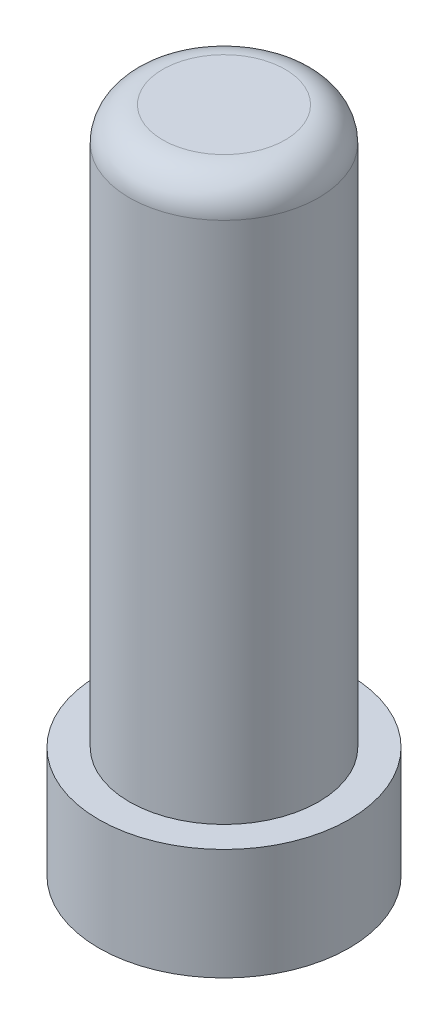
ISO-10303-21;
HEADER;
FILE_DESCRIPTION(('STEP AP214'),'2;1');
FILE_NAME('part.step','',(''),(''),'','','');
FILE_SCHEMA(('AUTOMOTIVE_DESIGN { 1 0 10303 214 1 1 1 1 }'));
ENDSEC;
DATA;
#1=APPLICATION_CONTEXT('core data for automotive mechanical design processes');
#2=APPLICATION_PROTOCOL_DEFINITION('international standard','automotive_design',2000,#1);
#3=PRODUCT_CONTEXT('',#1,'mechanical');
#4=PRODUCT('Part','Part','',(#3));
#5=PRODUCT_RELATED_PRODUCT_CATEGORY('part','',(#4));
#6=PRODUCT_DEFINITION_FORMATION('','',#4);
#7=PRODUCT_DEFINITION_CONTEXT('part definition',#1,'design');
#8=PRODUCT_DEFINITION('design','',#6,#7);
#9=PRODUCT_DEFINITION_SHAPE('','',#8);
#10=(LENGTH_UNIT() NAMED_UNIT(*) SI_UNIT(.MILLI.,.METRE.));
#11=(NAMED_UNIT(*) PLANE_ANGLE_UNIT() SI_UNIT($,.RADIAN.));
#12=(NAMED_UNIT(*) SI_UNIT($,.STERADIAN.) SOLID_ANGLE_UNIT());
#13=UNCERTAINTY_MEASURE_WITH_UNIT(LENGTH_MEASURE(1.E-05),#10,'distance_accuracy_value','');
#14=(GEOMETRIC_REPRESENTATION_CONTEXT(3) GLOBAL_UNCERTAINTY_ASSIGNED_CONTEXT((#13)) GLOBAL_UNIT_ASSIGNED_CONTEXT((#10,
#11,#12)) REPRESENTATION_CONTEXT('',''));
#15=CARTESIAN_POINT('',(0.,0.,0.));
#16=DIRECTION('',(0.,0.,1.));
#17=DIRECTION('',(1.,0.,0.));
#18=AXIS2_PLACEMENT_3D('',#15,#16,#17);
#19=CARTESIAN_POINT('',(0.,2.,0.));
#20=DIRECTION('',(0.,-1.,0.));
#21=DIRECTION('',(0.,0.,-1.));
#22=AXIS2_PLACEMENT_3D('',#19,#20,#21);
#23=CYLINDRICAL_SURFACE('',#22,2.25);
#24=CARTESIAN_POINT('',(0.,2.,0.));
#25=DIRECTION('',(0.,1.,0.));
#26=DIRECTION('',(0.,0.,1.));
#27=AXIS2_PLACEMENT_3D('',#24,#25,#26);
#28=CIRCLE('',#27,2.25);
#29=CARTESIAN_POINT('',(0.,2.,2.25));
#30=VERTEX_POINT('',#29);
#31=EDGE_CURVE('E59',#30,#30,#28,.T.);
#32=ORIENTED_EDGE('',*,*,#31,.F.);
#33=EDGE_LOOP('',(#32));
#34=FACE_BOUND('',#33,.T.);
#35=CARTESIAN_POINT('',(0.,0.,0.));
#36=DIRECTION('',(0.,1.,0.));
#37=DIRECTION('',(0.,0.,1.));
#38=AXIS2_PLACEMENT_3D('',#35,#36,#37);
#39=CIRCLE('',#38,2.25);
#40=CARTESIAN_POINT('',(0.,0.,2.25));
#41=VERTEX_POINT('',#40);
#42=EDGE_CURVE('E62',#41,#41,#39,.T.);
#43=ORIENTED_EDGE('',*,*,#42,.T.);
#44=EDGE_LOOP('',(#43));
#45=FACE_BOUND('',#44,.T.);
#46=ADVANCED_FACE('F41',(#34,#45),#23,.T.);
#47=CARTESIAN_POINT('',(0.,2.,0.));
#48=DIRECTION('',(0.,1.,0.));
#49=DIRECTION('',(0.,0.,1.));
#50=AXIS2_PLACEMENT_3D('',#47,#48,#49);
#51=PLANE('',#50);
#52=CARTESIAN_POINT('',(0.,2.,0.));
#53=DIRECTION('',(0.,1.,0.));
#54=DIRECTION('',(0.,0.,1.));
#55=AXIS2_PLACEMENT_3D('',#52,#53,#54);
#56=CIRCLE('',#55,1.7);
#57=CARTESIAN_POINT('',(0.,2.,1.7));
#58=VERTEX_POINT('',#57);
#59=EDGE_CURVE('E54',#58,#58,#56,.T.);
#60=ORIENTED_EDGE('',*,*,#59,.F.);
#61=EDGE_LOOP('',(#60));
#62=FACE_BOUND('',#61,.T.);
#63=ORIENTED_EDGE('',*,*,#31,.T.);
#64=EDGE_LOOP('',(#63));
#65=FACE_BOUND('',#64,.T.);
#66=ADVANCED_FACE('F70',(#62,#65),#51,.T.);
#67=CARTESIAN_POINT('',(0.,0.,0.));
#68=DIRECTION('',(0.,1.,0.));
#69=DIRECTION('',(0.,0.,1.));
#70=AXIS2_PLACEMENT_3D('',#67,#68,#69);
#71=PLANE('',#70);
#72=ORIENTED_EDGE('',*,*,#42,.F.);
#73=EDGE_LOOP('',(#72));
#74=FACE_BOUND('',#73,.T.);
#75=ADVANCED_FACE('F76',(#74),#71,.F.);
#76=CARTESIAN_POINT('',(0.,12.,0.));
#77=DIRECTION('',(0.,-1.,0.));
#78=DIRECTION('',(0.,0.,-1.));
#79=AXIS2_PLACEMENT_3D('',#76,#77,#78);
#80=CYLINDRICAL_SURFACE('',#79,1.7);
#81=CARTESIAN_POINT('',(0.,11.4,0.));
#82=DIRECTION('',(0.,1.,0.));
#83=DIRECTION('',(0.,0.,1.));
#84=AXIS2_PLACEMENT_3D('',#81,#82,#83);
#85=CIRCLE('',#84,1.7);
#86=CARTESIAN_POINT('',(0.,11.4,1.7));
#87=VERTEX_POINT('',#86);
#88=EDGE_CURVE('E10',#87,#87,#85,.F.);
#89=ORIENTED_EDGE('',*,*,#88,.T.);
#90=EDGE_LOOP('',(#89));
#91=FACE_BOUND('',#90,.T.);
#92=ORIENTED_EDGE('',*,*,#59,.T.);
#93=EDGE_LOOP('',(#92));
#94=FACE_BOUND('',#93,.T.);
#95=ADVANCED_FACE('F78',(#91,#94),#80,.T.);
#96=CARTESIAN_POINT('',(0.,12.,0.));
#97=DIRECTION('',(0.,1.,0.));
#98=DIRECTION('',(0.,0.,1.));
#99=AXIS2_PLACEMENT_3D('',#96,#97,#98);
#100=PLANE('',#99);
#101=CARTESIAN_POINT('',(0.,12.,0.));
#102=DIRECTION('',(0.,1.,0.));
#103=DIRECTION('',(0.,0.,1.));
#104=AXIS2_PLACEMENT_3D('',#101,#102,#103);
#105=CIRCLE('',#104,1.1);
#106=CARTESIAN_POINT('',(0.,12.,1.1));
#107=VERTEX_POINT('',#106);
#108=EDGE_CURVE('E49',#107,#107,#105,.T.);
#109=ORIENTED_EDGE('',*,*,#108,.T.);
#110=EDGE_LOOP('',(#109));
#111=FACE_BOUND('',#110,.T.);
#112=ADVANCED_FACE('F84',(#111),#100,.T.);
#113=CARTESIAN_POINT('',(0.,11.4,0.));
#114=DIRECTION('',(0.,1.,0.));
#115=DIRECTION('',(0.,0.,1.));
#116=AXIS2_PLACEMENT_3D('',#113,#114,#115);
#117=TOROIDAL_SURFACE('',#116,1.1,0.6);
#118=ORIENTED_EDGE('',*,*,#88,.F.);
#119=EDGE_LOOP('',(#118));
#120=FACE_BOUND('',#119,.T.);
#121=ORIENTED_EDGE('',*,*,#108,.F.);
#122=EDGE_LOOP('',(#121));
#123=FACE_BOUND('',#122,.T.);
#124=ADVANCED_FACE('F43',(#120,#123),#117,.T.);
#125=CLOSED_SHELL('',(#46,#66,#75,#95,#112,#124));
#126=MANIFOLD_SOLID_BREP('B2',#125);
#127=ADVANCED_BREP_SHAPE_REPRESENTATION('',(#18,#126),#14);
#128=SHAPE_DEFINITION_REPRESENTATION(#9,#127);
ENDSEC;
END-ISO-10303-21;
